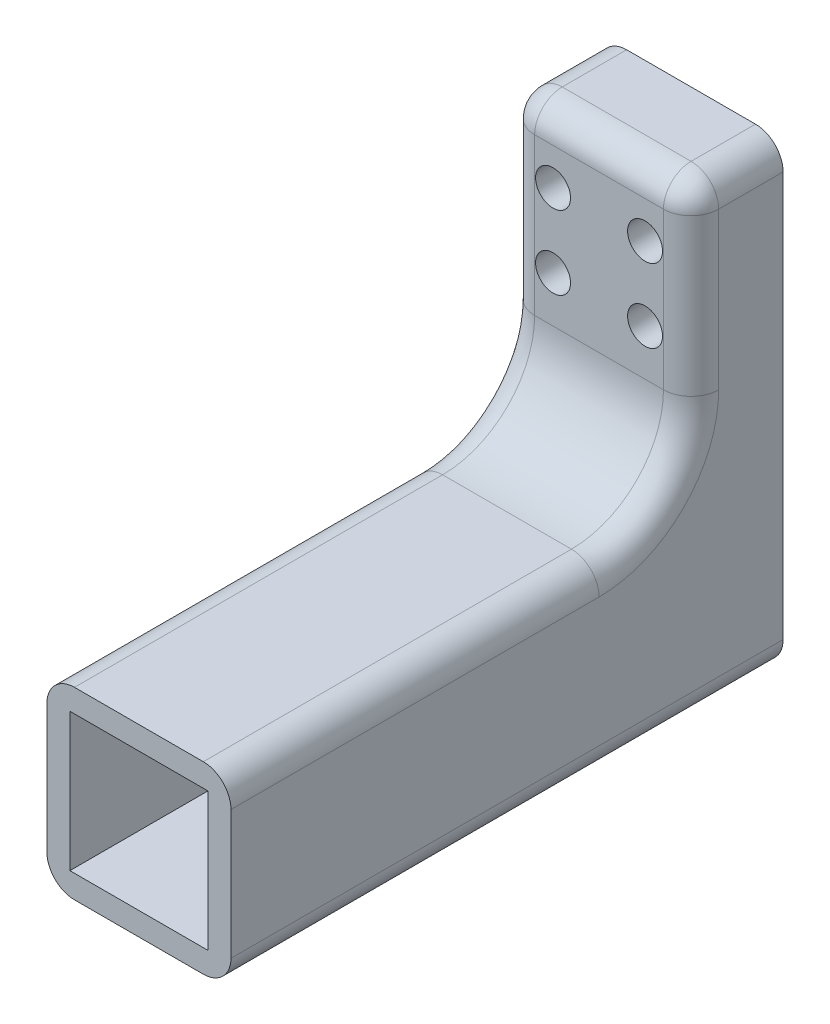
ISO-10303-21;
HEADER;
FILE_DESCRIPTION(('STEP AP214'),'2;1');
FILE_NAME('part.step','',(''),(''),'','','');
FILE_SCHEMA(('AUTOMOTIVE_DESIGN { 1 0 10303 214 1 1 1 1 }'));
ENDSEC;
DATA;
#1=APPLICATION_CONTEXT('core data for automotive mechanical design processes');
#2=APPLICATION_PROTOCOL_DEFINITION('international standard','automotive_design',2000,#1);
#3=PRODUCT_CONTEXT('',#1,'mechanical');
#4=PRODUCT('Part','Part','',(#3));
#5=PRODUCT_RELATED_PRODUCT_CATEGORY('part','',(#4));
#6=PRODUCT_DEFINITION_FORMATION('','',#4);
#7=PRODUCT_DEFINITION_CONTEXT('part definition',#1,'design');
#8=PRODUCT_DEFINITION('design','',#6,#7);
#9=PRODUCT_DEFINITION_SHAPE('','',#8);
#10=(LENGTH_UNIT() NAMED_UNIT(*) SI_UNIT(.MILLI.,.METRE.));
#11=(NAMED_UNIT(*) PLANE_ANGLE_UNIT() SI_UNIT($,.RADIAN.));
#12=(NAMED_UNIT(*) SI_UNIT($,.STERADIAN.) SOLID_ANGLE_UNIT());
#13=UNCERTAINTY_MEASURE_WITH_UNIT(LENGTH_MEASURE(1.E-05),#10,'distance_accuracy_value','');
#14=(GEOMETRIC_REPRESENTATION_CONTEXT(3) GLOBAL_UNCERTAINTY_ASSIGNED_CONTEXT((#13)) GLOBAL_UNIT_ASSIGNED_CONTEXT((#10,
#11,#12)) REPRESENTATION_CONTEXT('',''));
#15=CARTESIAN_POINT('',(0.,0.,0.));
#16=DIRECTION('',(0.,0.,1.));
#17=DIRECTION('',(1.,0.,0.));
#18=AXIS2_PLACEMENT_3D('',#15,#16,#17);
#19=CARTESIAN_POINT('',(-10.,10.,60.));
#20=DIRECTION('',(0.,-1.,0.));
#21=DIRECTION('',(0.,0.,-1.));
#22=AXIS2_PLACEMENT_3D('',#19,#20,#21);
#23=PLANE('',#22);
#24=DIRECTION('',(1.,0.,0.));
#25=VECTOR('',#24,1.);
#26=CARTESIAN_POINT('',(-10.,10.,20.));
#27=LINE('',#26,#25);
#28=CARTESIAN_POINT('',(7.,10.,20.));
#29=VERTEX_POINT('',#28);
#30=CARTESIAN_POINT('',(-7.,10.,20.));
#31=VERTEX_POINT('',#30);
#32=EDGE_CURVE('E236',#29,#31,#27,.F.);
#33=ORIENTED_EDGE('',*,*,#32,.T.);
#34=DIRECTION('',(0.,0.,-1.));
#35=VECTOR('',#34,1.);
#36=CARTESIAN_POINT('',(-7.,10.,60.));
#37=LINE('',#36,#35);
#38=CARTESIAN_POINT('',(-7.,10.,60.));
#39=VERTEX_POINT('',#38);
#40=EDGE_CURVE('E280',#31,#39,#37,.F.);
#41=ORIENTED_EDGE('',*,*,#40,.T.);
#42=DIRECTION('',(-1.,0.,0.));
#43=VECTOR('',#42,1.);
#44=CARTESIAN_POINT('',(-10.,10.,60.));
#45=LINE('',#44,#43);
#46=CARTESIAN_POINT('',(7.,10.,60.));
#47=VERTEX_POINT('',#46);
#48=EDGE_CURVE('E221',#47,#39,#45,.T.);
#49=ORIENTED_EDGE('',*,*,#48,.F.);
#50=DIRECTION('',(0.,0.,-1.));
#51=VECTOR('',#50,1.);
#52=CARTESIAN_POINT('',(7.,10.,60.));
#53=LINE('',#52,#51);
#54=EDGE_CURVE('E278',#47,#29,#53,.T.);
#55=ORIENTED_EDGE('',*,*,#54,.T.);
#56=EDGE_LOOP('',(#33,#41,#49,#55));
#57=FACE_BOUND('',#56,.T.);
#58=ADVANCED_FACE('F41',(#57),#23,.F.);
#59=CARTESIAN_POINT('',(0.,0.,60.));
#60=DIRECTION('',(0.,0.,1.));
#61=DIRECTION('',(1.,0.,0.));
#62=AXIS2_PLACEMENT_3D('',#59,#60,#61);
#63=PLANE('',#62);
#64=DIRECTION('',(1.,0.,0.));
#65=VECTOR('',#64,1.);
#66=CARTESIAN_POINT('',(-10.,-10.,60.));
#67=LINE('',#66,#65);
#68=CARTESIAN_POINT('',(-7.,-10.,60.));
#69=VERTEX_POINT('',#68);
#70=CARTESIAN_POINT('',(7.,-10.,60.));
#71=VERTEX_POINT('',#70);
#72=EDGE_CURVE('E227',#69,#71,#67,.T.);
#73=ORIENTED_EDGE('',*,*,#72,.T.);
#74=CARTESIAN_POINT('',(7.,-7.,60.));
#75=DIRECTION('',(0.,0.,1.));
#76=DIRECTION('',(1.,0.,0.));
#77=AXIS2_PLACEMENT_3D('',#74,#75,#76);
#78=CIRCLE('',#77,3.);
#79=CARTESIAN_POINT('',(10.,-7.,60.));
#80=VERTEX_POINT('',#79);
#81=EDGE_CURVE('E49',#71,#80,#78,.T.);
#82=ORIENTED_EDGE('',*,*,#81,.T.);
#83=DIRECTION('',(0.,1.,0.));
#84=VECTOR('',#83,1.);
#85=CARTESIAN_POINT('',(10.,10.,60.));
#86=LINE('',#85,#84);
#87=CARTESIAN_POINT('',(10.,7.,60.));
#88=VERTEX_POINT('',#87);
#89=EDGE_CURVE('E219',#80,#88,#86,.T.);
#90=ORIENTED_EDGE('',*,*,#89,.T.);
#91=CARTESIAN_POINT('',(7.,7.,60.));
#92=DIRECTION('',(0.,0.,1.));
#93=DIRECTION('',(1.,0.,0.));
#94=AXIS2_PLACEMENT_3D('',#91,#92,#93);
#95=CIRCLE('',#94,3.);
#96=EDGE_CURVE('E282',#88,#47,#95,.T.);
#97=ORIENTED_EDGE('',*,*,#96,.T.);
#98=ORIENTED_EDGE('',*,*,#48,.T.);
#99=CARTESIAN_POINT('',(-7.,7.,60.));
#100=DIRECTION('',(0.,0.,1.));
#101=DIRECTION('',(1.,0.,0.));
#102=AXIS2_PLACEMENT_3D('',#99,#100,#101);
#103=CIRCLE('',#102,3.);
#104=CARTESIAN_POINT('',(-10.,7.,60.));
#105=VERTEX_POINT('',#104);
#106=EDGE_CURVE('E284',#39,#105,#103,.T.);
#107=ORIENTED_EDGE('',*,*,#106,.T.);
#108=DIRECTION('',(0.,-1.,0.));
#109=VECTOR('',#108,1.);
#110=CARTESIAN_POINT('',(-10.,10.,60.));
#111=LINE('',#110,#109);
#112=CARTESIAN_POINT('',(-10.,-7.,60.));
#113=VERTEX_POINT('',#112);
#114=EDGE_CURVE('E225',#105,#113,#111,.T.);
#115=ORIENTED_EDGE('',*,*,#114,.T.);
#116=CARTESIAN_POINT('',(-7.,-7.,60.));
#117=DIRECTION('',(0.,0.,1.));
#118=DIRECTION('',(1.,0.,0.));
#119=AXIS2_PLACEMENT_3D('',#116,#117,#118);
#120=CIRCLE('',#119,3.);
#121=EDGE_CURVE('E327',#113,#69,#120,.T.);
#122=ORIENTED_EDGE('',*,*,#121,.T.);
#123=EDGE_LOOP('',(#73,#82,#90,#97,#98,#107,#115,#122));
#124=FACE_BOUND('',#123,.T.);
#125=DIRECTION('',(-1.,0.,0.));
#126=VECTOR('',#125,1.);
#127=CARTESIAN_POINT('',(-7.5,7.5,60.));
#128=LINE('',#127,#126);
#129=CARTESIAN_POINT('',(7.5,7.5,60.));
#130=VERTEX_POINT('',#129);
#131=CARTESIAN_POINT('',(-7.5,7.5,60.));
#132=VERTEX_POINT('',#131);
#133=EDGE_CURVE('E185',#130,#132,#128,.T.);
#134=ORIENTED_EDGE('',*,*,#133,.F.);
#135=DIRECTION('',(0.,1.,0.));
#136=VECTOR('',#135,1.);
#137=CARTESIAN_POINT('',(7.5,7.5,60.));
#138=LINE('',#137,#136);
#139=CARTESIAN_POINT('',(7.5,-7.5,60.));
#140=VERTEX_POINT('',#139);
#141=EDGE_CURVE('E175',#140,#130,#138,.T.);
#142=ORIENTED_EDGE('',*,*,#141,.F.);
#143=DIRECTION('',(1.,0.,0.));
#144=VECTOR('',#143,1.);
#145=CARTESIAN_POINT('',(-7.5,-7.5,60.));
#146=LINE('',#145,#144);
#147=CARTESIAN_POINT('',(-7.5,-7.5,60.));
#148=VERTEX_POINT('',#147);
#149=EDGE_CURVE('E201',#148,#140,#146,.T.);
#150=ORIENTED_EDGE('',*,*,#149,.F.);
#151=DIRECTION('',(0.,-1.,0.));
#152=VECTOR('',#151,1.);
#153=CARTESIAN_POINT('',(-7.5,7.5,60.));
#154=LINE('',#153,#152);
#155=EDGE_CURVE('E199',#132,#148,#154,.T.);
#156=ORIENTED_EDGE('',*,*,#155,.F.);
#157=EDGE_LOOP('',(#134,#142,#150,#156));
#158=FACE_BOUND('',#157,.T.);
#159=ADVANCED_FACE('F197',(#124,#158),#63,.T.);
#160=CARTESIAN_POINT('',(0.,0.,0.));
#161=DIRECTION('',(0.,0.,1.));
#162=DIRECTION('',(1.,0.,0.));
#163=AXIS2_PLACEMENT_3D('',#160,#161,#162);
#164=PLANE('',#163);
#165=CARTESIAN_POINT('',(-5.,25.,0.));
#166=DIRECTION('',(0.,0.,1.));
#167=DIRECTION('',(1.,0.,0.));
#168=AXIS2_PLACEMENT_3D('',#165,#166,#167);
#169=CIRCLE('',#168,1.9);
#170=CARTESIAN_POINT('',(-3.1,25.,0.));
#171=VERTEX_POINT('',#170);
#172=EDGE_CURVE('E409',#171,#171,#169,.T.);
#173=ORIENTED_EDGE('',*,*,#172,.T.);
#174=EDGE_LOOP('',(#173));
#175=FACE_BOUND('',#174,.T.);
#176=CARTESIAN_POINT('',(-5.,33.,0.));
#177=DIRECTION('',(0.,0.,1.));
#178=DIRECTION('',(1.,0.,0.));
#179=AXIS2_PLACEMENT_3D('',#176,#177,#178);
#180=CIRCLE('',#179,1.9);
#181=CARTESIAN_POINT('',(-3.1,33.,0.));
#182=VERTEX_POINT('',#181);
#183=EDGE_CURVE('E415',#182,#182,#180,.T.);
#184=ORIENTED_EDGE('',*,*,#183,.T.);
#185=EDGE_LOOP('',(#184));
#186=FACE_BOUND('',#185,.T.);
#187=CARTESIAN_POINT('',(5.,33.,0.));
#188=DIRECTION('',(0.,0.,1.));
#189=DIRECTION('',(1.,0.,0.));
#190=AXIS2_PLACEMENT_3D('',#187,#188,#189);
#191=CIRCLE('',#190,1.9);
#192=CARTESIAN_POINT('',(6.9,33.,0.));
#193=VERTEX_POINT('',#192);
#194=EDGE_CURVE('E403',#193,#193,#191,.T.);
#195=ORIENTED_EDGE('',*,*,#194,.T.);
#196=EDGE_LOOP('',(#195));
#197=FACE_BOUND('',#196,.T.);
#198=CARTESIAN_POINT('',(5.,25.,0.));
#199=DIRECTION('',(0.,0.,1.));
#200=DIRECTION('',(1.,0.,0.));
#201=AXIS2_PLACEMENT_3D('',#198,#199,#200);
#202=CIRCLE('',#201,1.9);
#203=CARTESIAN_POINT('',(6.9,25.,0.));
#204=VERTEX_POINT('',#203);
#205=EDGE_CURVE('E400',#204,#204,#202,.T.);
#206=ORIENTED_EDGE('',*,*,#205,.T.);
#207=EDGE_LOOP('',(#206));
#208=FACE_BOUND('',#207,.T.);
#209=DIRECTION('',(0.,1.,0.));
#210=VECTOR('',#209,1.);
#211=CARTESIAN_POINT('',(10.,10.,0.));
#212=LINE('',#211,#210);
#213=CARTESIAN_POINT('',(10.,-7.,0.));
#214=VERTEX_POINT('',#213);
#215=CARTESIAN_POINT('',(9.99999999999999,37.,0.));
#216=VERTEX_POINT('',#215);
#217=EDGE_CURVE('E193',#214,#216,#212,.T.);
#218=ORIENTED_EDGE('',*,*,#217,.F.);
#219=CARTESIAN_POINT('',(7.,-7.,0.));
#220=DIRECTION('',(0.,0.,1.));
#221=DIRECTION('',(1.,0.,0.));
#222=AXIS2_PLACEMENT_3D('',#219,#220,#221);
#223=CIRCLE('',#222,3.);
#224=CARTESIAN_POINT('',(7.,-10.,0.));
#225=VERTEX_POINT('',#224);
#226=EDGE_CURVE('E321',#214,#225,#223,.F.);
#227=ORIENTED_EDGE('',*,*,#226,.T.);
#228=DIRECTION('',(1.,0.,0.));
#229=VECTOR('',#228,1.);
#230=CARTESIAN_POINT('',(-10.,-10.,0.));
#231=LINE('',#230,#229);
#232=CARTESIAN_POINT('',(-7.,-10.,0.));
#233=VERTEX_POINT('',#232);
#234=EDGE_CURVE('E222',#233,#225,#231,.T.);
#235=ORIENTED_EDGE('',*,*,#234,.F.);
#236=CARTESIAN_POINT('',(-7.,-7.,0.));
#237=DIRECTION('',(0.,0.,1.));
#238=DIRECTION('',(1.,0.,0.));
#239=AXIS2_PLACEMENT_3D('',#236,#237,#238);
#240=CIRCLE('',#239,3.);
#241=CARTESIAN_POINT('',(-10.,-7.,0.));
#242=VERTEX_POINT('',#241);
#243=EDGE_CURVE('E319',#233,#242,#240,.F.);
#244=ORIENTED_EDGE('',*,*,#243,.T.);
#245=DIRECTION('',(0.,-1.,0.));
#246=VECTOR('',#245,1.);
#247=CARTESIAN_POINT('',(-10.,10.,0.));
#248=LINE('',#247,#246);
#249=CARTESIAN_POINT('',(-10.,37.,0.));
#250=VERTEX_POINT('',#249);
#251=EDGE_CURVE('E231',#250,#242,#248,.T.);
#252=ORIENTED_EDGE('',*,*,#251,.F.);
#253=CARTESIAN_POINT('',(-7.00000000000001,37.,0.));
#254=DIRECTION('',(0.,0.,1.));
#255=DIRECTION('',(1.,0.,0.));
#256=AXIS2_PLACEMENT_3D('',#253,#254,#255);
#257=CIRCLE('',#256,3.);
#258=CARTESIAN_POINT('',(-7.,40.,0.));
#259=VERTEX_POINT('',#258);
#260=EDGE_CURVE('E273',#250,#259,#257,.F.);
#261=ORIENTED_EDGE('',*,*,#260,.T.);
#262=DIRECTION('',(-1.,0.,0.));
#263=VECTOR('',#262,1.);
#264=CARTESIAN_POINT('',(10.,40.,0.));
#265=LINE('',#264,#263);
#266=CARTESIAN_POINT('',(6.99999999999999,40.,0.));
#267=VERTEX_POINT('',#266);
#268=EDGE_CURVE('E208',#267,#259,#265,.T.);
#269=ORIENTED_EDGE('',*,*,#268,.F.);
#270=CARTESIAN_POINT('',(6.99999999999999,37.,0.));
#271=DIRECTION('',(0.,0.,1.));
#272=DIRECTION('',(1.,0.,0.));
#273=AXIS2_PLACEMENT_3D('',#270,#271,#272);
#274=CIRCLE('',#273,3.);
#275=EDGE_CURVE('E275',#267,#216,#274,.F.);
#276=ORIENTED_EDGE('',*,*,#275,.T.);
#277=EDGE_LOOP('',(#218,#227,#235,#244,#252,#261,#269,#276));
#278=FACE_BOUND('',#277,.T.);
#279=DIRECTION('',(0.,1.,0.));
#280=VECTOR('',#279,1.);
#281=CARTESIAN_POINT('',(7.5,7.5,0.));
#282=LINE('',#281,#280);
#283=CARTESIAN_POINT('',(7.5,-7.5,0.));
#284=VERTEX_POINT('',#283);
#285=CARTESIAN_POINT('',(7.5,7.5,0.));
#286=VERTEX_POINT('',#285);
#287=EDGE_CURVE('E206',#284,#286,#282,.T.);
#288=ORIENTED_EDGE('',*,*,#287,.T.);
#289=DIRECTION('',(-1.,0.,0.));
#290=VECTOR('',#289,1.);
#291=CARTESIAN_POINT('',(-7.5,7.5,0.));
#292=LINE('',#291,#290);
#293=CARTESIAN_POINT('',(-7.5,7.5,0.));
#294=VERTEX_POINT('',#293);
#295=EDGE_CURVE('E192',#286,#294,#292,.T.);
#296=ORIENTED_EDGE('',*,*,#295,.T.);
#297=DIRECTION('',(0.,-1.,0.));
#298=VECTOR('',#297,1.);
#299=CARTESIAN_POINT('',(-7.5,7.5,0.));
#300=LINE('',#299,#298);
#301=CARTESIAN_POINT('',(-7.5,-7.5,0.));
#302=VERTEX_POINT('',#301);
#303=EDGE_CURVE('E210',#294,#302,#300,.T.);
#304=ORIENTED_EDGE('',*,*,#303,.T.);
#305=DIRECTION('',(1.,0.,0.));
#306=VECTOR('',#305,1.);
#307=CARTESIAN_POINT('',(-7.5,-7.5,0.));
#308=LINE('',#307,#306);
#309=EDGE_CURVE('E186',#302,#284,#308,.T.);
#310=ORIENTED_EDGE('',*,*,#309,.T.);
#311=EDGE_LOOP('',(#288,#296,#304,#310));
#312=FACE_BOUND('',#311,.T.);
#313=ADVANCED_FACE('F341',(#175,#186,#197,#208,#278,#312),#164,.F.);
#314=CARTESIAN_POINT('',(10.,10.,60.));
#315=DIRECTION('',(-1.,0.,0.));
#316=DIRECTION('',(0.,-1.,0.));
#317=AXIS2_PLACEMENT_3D('',#314,#315,#316);
#318=PLANE('',#317);
#319=ORIENTED_EDGE('',*,*,#89,.F.);
#320=DIRECTION('',(0.,0.,-1.));
#321=VECTOR('',#320,1.);
#322=CARTESIAN_POINT('',(10.,-7.,60.));
#323=LINE('',#322,#321);
#324=EDGE_CURVE('E286',#80,#214,#323,.T.);
#325=ORIENTED_EDGE('',*,*,#324,.T.);
#326=ORIENTED_EDGE('',*,*,#217,.T.);
#327=DIRECTION('',(0.,0.,-1.));
#328=VECTOR('',#327,1.);
#329=CARTESIAN_POINT('',(9.99999999999999,37.,60.));
#330=LINE('',#329,#328);
#331=CARTESIAN_POINT('',(9.99999999999999,37.,7.));
#332=VERTEX_POINT('',#331);
#333=EDGE_CURVE('E265',#216,#332,#330,.F.);
#334=ORIENTED_EDGE('',*,*,#333,.T.);
#335=DIRECTION('',(0.,1.,0.));
#336=VECTOR('',#335,1.);
#337=CARTESIAN_POINT('',(9.99999999999999,20.,7.));
#338=LINE('',#337,#336);
#339=CARTESIAN_POINT('',(9.99999999999999,20.,7.));
#340=VERTEX_POINT('',#339);
#341=EDGE_CURVE('E263',#332,#340,#338,.F.);
#342=ORIENTED_EDGE('',*,*,#341,.T.);
#343=CARTESIAN_POINT('',(9.99999999999999,20.,20.));
#344=DIRECTION('',(-1.,0.,0.));
#345=DIRECTION('',(0.,-1.,0.));
#346=AXIS2_PLACEMENT_3D('',#343,#344,#345);
#347=CIRCLE('',#346,13.);
#348=CARTESIAN_POINT('',(10.,7.,20.));
#349=VERTEX_POINT('',#348);
#350=EDGE_CURVE('E261',#340,#349,#347,.T.);
#351=ORIENTED_EDGE('',*,*,#350,.T.);
#352=DIRECTION('',(0.,0.,-1.));
#353=VECTOR('',#352,1.);
#354=CARTESIAN_POINT('',(10.,7.,60.));
#355=LINE('',#354,#353);
#356=EDGE_CURVE('E258',#349,#88,#355,.F.);
#357=ORIENTED_EDGE('',*,*,#356,.T.);
#358=EDGE_LOOP('',(#319,#325,#326,#334,#342,#351,#357));
#359=FACE_BOUND('',#358,.T.);
#360=ADVANCED_FACE('F334',(#359),#318,.F.);
#361=CARTESIAN_POINT('',(-10.,10.,60.));
#362=DIRECTION('',(1.,0.,0.));
#363=DIRECTION('',(0.,1.,0.));
#364=AXIS2_PLACEMENT_3D('',#361,#362,#363);
#365=PLANE('',#364);
#366=ORIENTED_EDGE('',*,*,#251,.T.);
#367=DIRECTION('',(0.,0.,-1.));
#368=VECTOR('',#367,1.);
#369=CARTESIAN_POINT('',(-10.,-7.,60.));
#370=LINE('',#369,#368);
#371=EDGE_CURVE('E11',#242,#113,#370,.F.);
#372=ORIENTED_EDGE('',*,*,#371,.T.);
#373=ORIENTED_EDGE('',*,*,#114,.F.);
#374=DIRECTION('',(0.,0.,-1.));
#375=VECTOR('',#374,1.);
#376=CARTESIAN_POINT('',(-10.,7.,60.));
#377=LINE('',#376,#375);
#378=CARTESIAN_POINT('',(-10.,7.,20.));
#379=VERTEX_POINT('',#378);
#380=EDGE_CURVE('E246',#105,#379,#377,.T.);
#381=ORIENTED_EDGE('',*,*,#380,.T.);
#382=CARTESIAN_POINT('',(-10.,20.,20.));
#383=DIRECTION('',(1.,0.,0.));
#384=DIRECTION('',(0.,1.,0.));
#385=AXIS2_PLACEMENT_3D('',#382,#383,#384);
#386=CIRCLE('',#385,13.);
#387=CARTESIAN_POINT('',(-10.,20.,7.));
#388=VERTEX_POINT('',#387);
#389=EDGE_CURVE('E248',#379,#388,#386,.T.);
#390=ORIENTED_EDGE('',*,*,#389,.T.);
#391=DIRECTION('',(0.,-1.,0.));
#392=VECTOR('',#391,1.);
#393=CARTESIAN_POINT('',(-10.,40.,7.));
#394=LINE('',#393,#392);
#395=CARTESIAN_POINT('',(-10.,37.,7.));
#396=VERTEX_POINT('',#395);
#397=EDGE_CURVE('E250',#388,#396,#394,.F.);
#398=ORIENTED_EDGE('',*,*,#397,.T.);
#399=DIRECTION('',(0.,0.,-1.));
#400=VECTOR('',#399,1.);
#401=CARTESIAN_POINT('',(-10.,37.,60.));
#402=LINE('',#401,#400);
#403=EDGE_CURVE('E252',#396,#250,#402,.T.);
#404=ORIENTED_EDGE('',*,*,#403,.T.);
#405=EDGE_LOOP('',(#366,#372,#373,#381,#390,#398,#404));
#406=FACE_BOUND('',#405,.T.);
#407=ADVANCED_FACE('F349',(#406),#365,.F.);
#408=CARTESIAN_POINT('',(-10.,-10.,60.));
#409=DIRECTION('',(0.,1.,0.));
#410=DIRECTION('',(0.,0.,1.));
#411=AXIS2_PLACEMENT_3D('',#408,#409,#410);
#412=PLANE('',#411);
#413=ORIENTED_EDGE('',*,*,#234,.T.);
#414=DIRECTION('',(0.,0.,-1.));
#415=VECTOR('',#414,1.);
#416=CARTESIAN_POINT('',(7.,-10.,60.));
#417=LINE('',#416,#415);
#418=EDGE_CURVE('E62',#225,#71,#417,.F.);
#419=ORIENTED_EDGE('',*,*,#418,.T.);
#420=ORIENTED_EDGE('',*,*,#72,.F.);
#421=DIRECTION('',(0.,0.,-1.));
#422=VECTOR('',#421,1.);
#423=CARTESIAN_POINT('',(-7.,-10.,60.));
#424=LINE('',#423,#422);
#425=EDGE_CURVE('E323',#69,#233,#424,.T.);
#426=ORIENTED_EDGE('',*,*,#425,.T.);
#427=EDGE_LOOP('',(#413,#419,#420,#426));
#428=FACE_BOUND('',#427,.T.);
#429=ADVANCED_FACE('F343',(#428),#412,.F.);
#430=CARTESIAN_POINT('',(7.5,7.5,60.));
#431=DIRECTION('',(-1.,0.,0.));
#432=DIRECTION('',(0.,-1.,0.));
#433=AXIS2_PLACEMENT_3D('',#430,#431,#432);
#434=PLANE('',#433);
#435=ORIENTED_EDGE('',*,*,#287,.F.);
#436=DIRECTION('',(0.,0.,-1.));
#437=VECTOR('',#436,1.);
#438=CARTESIAN_POINT('',(7.5,-7.5,60.));
#439=LINE('',#438,#437);
#440=EDGE_CURVE('E181',#140,#284,#439,.T.);
#441=ORIENTED_EDGE('',*,*,#440,.F.);
#442=ORIENTED_EDGE('',*,*,#141,.T.);
#443=DIRECTION('',(0.,0.,-1.));
#444=VECTOR('',#443,1.);
#445=CARTESIAN_POINT('',(7.5,7.5,60.));
#446=LINE('',#445,#444);
#447=EDGE_CURVE('E178',#130,#286,#446,.T.);
#448=ORIENTED_EDGE('',*,*,#447,.T.);
#449=EDGE_LOOP('',(#435,#441,#442,#448));
#450=FACE_BOUND('',#449,.T.);
#451=ADVANCED_FACE('F177',(#450),#434,.T.);
#452=CARTESIAN_POINT('',(-7.5,7.5,60.));
#453=DIRECTION('',(0.,-1.,0.));
#454=DIRECTION('',(0.,0.,-1.));
#455=AXIS2_PLACEMENT_3D('',#452,#453,#454);
#456=PLANE('',#455);
#457=ORIENTED_EDGE('',*,*,#295,.F.);
#458=ORIENTED_EDGE('',*,*,#447,.F.);
#459=ORIENTED_EDGE('',*,*,#133,.T.);
#460=DIRECTION('',(0.,0.,-1.));
#461=VECTOR('',#460,1.);
#462=CARTESIAN_POINT('',(-7.5,7.5,60.));
#463=LINE('',#462,#461);
#464=EDGE_CURVE('E194',#132,#294,#463,.T.);
#465=ORIENTED_EDGE('',*,*,#464,.T.);
#466=EDGE_LOOP('',(#457,#458,#459,#465));
#467=FACE_BOUND('',#466,.T.);
#468=ADVANCED_FACE('F189',(#467),#456,.T.);
#469=CARTESIAN_POINT('',(-7.5,7.5,60.));
#470=DIRECTION('',(1.,0.,0.));
#471=DIRECTION('',(0.,1.,0.));
#472=AXIS2_PLACEMENT_3D('',#469,#470,#471);
#473=PLANE('',#472);
#474=ORIENTED_EDGE('',*,*,#303,.F.);
#475=ORIENTED_EDGE('',*,*,#464,.F.);
#476=ORIENTED_EDGE('',*,*,#155,.T.);
#477=DIRECTION('',(0.,0.,-1.));
#478=VECTOR('',#477,1.);
#479=CARTESIAN_POINT('',(-7.5,-7.5,60.));
#480=LINE('',#479,#478);
#481=EDGE_CURVE('E216',#148,#302,#480,.T.);
#482=ORIENTED_EDGE('',*,*,#481,.T.);
#483=EDGE_LOOP('',(#474,#475,#476,#482));
#484=FACE_BOUND('',#483,.T.);
#485=ADVANCED_FACE('F642',(#484),#473,.T.);
#486=CARTESIAN_POINT('',(-7.5,-7.5,60.));
#487=DIRECTION('',(0.,1.,0.));
#488=DIRECTION('',(0.,0.,1.));
#489=AXIS2_PLACEMENT_3D('',#486,#487,#488);
#490=PLANE('',#489);
#491=ORIENTED_EDGE('',*,*,#309,.F.);
#492=ORIENTED_EDGE('',*,*,#481,.F.);
#493=ORIENTED_EDGE('',*,*,#149,.T.);
#494=ORIENTED_EDGE('',*,*,#440,.T.);
#495=EDGE_LOOP('',(#491,#492,#493,#494));
#496=FACE_BOUND('',#495,.T.);
#497=ADVANCED_FACE('F624',(#496),#490,.T.);
#498=CARTESIAN_POINT('',(10.,40.,10.));
#499=DIRECTION('',(0.,-1.,0.));
#500=DIRECTION('',(0.,0.,-1.));
#501=AXIS2_PLACEMENT_3D('',#498,#499,#500);
#502=PLANE('',#501);
#503=DIRECTION('',(-1.,0.,0.));
#504=VECTOR('',#503,1.);
#505=CARTESIAN_POINT('',(10.,40.,7.));
#506=LINE('',#505,#504);
#507=CARTESIAN_POINT('',(-7.00000000000001,40.,7.));
#508=VERTEX_POINT('',#507);
#509=CARTESIAN_POINT('',(6.99999999999999,40.,7.));
#510=VERTEX_POINT('',#509);
#511=EDGE_CURVE('E269',#508,#510,#506,.F.);
#512=ORIENTED_EDGE('',*,*,#511,.T.);
#513=DIRECTION('',(0.,0.,-1.));
#514=VECTOR('',#513,1.);
#515=CARTESIAN_POINT('',(6.99999999999999,40.,10.));
#516=LINE('',#515,#514);
#517=EDGE_CURVE('E271',#510,#267,#516,.T.);
#518=ORIENTED_EDGE('',*,*,#517,.T.);
#519=ORIENTED_EDGE('',*,*,#268,.T.);
#520=DIRECTION('',(0.,0.,-1.));
#521=VECTOR('',#520,1.);
#522=CARTESIAN_POINT('',(-7.,40.,10.));
#523=LINE('',#522,#521);
#524=EDGE_CURVE('E267',#259,#508,#523,.F.);
#525=ORIENTED_EDGE('',*,*,#524,.T.);
#526=EDGE_LOOP('',(#512,#518,#519,#525));
#527=FACE_BOUND('',#526,.T.);
#528=ADVANCED_FACE('F392',(#527),#502,.F.);
#529=CARTESIAN_POINT('',(0.,0.,10.));
#530=DIRECTION('',(0.,0.,1.));
#531=DIRECTION('',(1.,0.,0.));
#532=AXIS2_PLACEMENT_3D('',#529,#530,#531);
#533=PLANE('',#532);
#534=CARTESIAN_POINT('',(-5.,25.,10.));
#535=DIRECTION('',(0.,0.,1.));
#536=DIRECTION('',(1.,0.,0.));
#537=AXIS2_PLACEMENT_3D('',#534,#535,#536);
#538=CIRCLE('',#537,1.9);
#539=CARTESIAN_POINT('',(-3.1,25.,10.));
#540=VERTEX_POINT('',#539);
#541=EDGE_CURVE('E406',#540,#540,#538,.T.);
#542=ORIENTED_EDGE('',*,*,#541,.F.);
#543=EDGE_LOOP('',(#542));
#544=FACE_BOUND('',#543,.T.);
#545=CARTESIAN_POINT('',(-5.,33.,10.));
#546=DIRECTION('',(0.,0.,1.));
#547=DIRECTION('',(1.,0.,0.));
#548=AXIS2_PLACEMENT_3D('',#545,#546,#547);
#549=CIRCLE('',#548,1.9);
#550=CARTESIAN_POINT('',(-3.1,33.,10.));
#551=VERTEX_POINT('',#550);
#552=EDGE_CURVE('E412',#551,#551,#549,.T.);
#553=ORIENTED_EDGE('',*,*,#552,.F.);
#554=EDGE_LOOP('',(#553));
#555=FACE_BOUND('',#554,.T.);
#556=CARTESIAN_POINT('',(5.,33.,10.));
#557=DIRECTION('',(0.,0.,1.));
#558=DIRECTION('',(1.,0.,0.));
#559=AXIS2_PLACEMENT_3D('',#556,#557,#558);
#560=CIRCLE('',#559,1.9);
#561=CARTESIAN_POINT('',(6.9,33.,10.));
#562=VERTEX_POINT('',#561);
#563=EDGE_CURVE('E418',#562,#562,#560,.T.);
#564=ORIENTED_EDGE('',*,*,#563,.F.);
#565=EDGE_LOOP('',(#564));
#566=FACE_BOUND('',#565,.T.);
#567=CARTESIAN_POINT('',(5.,25.,10.));
#568=DIRECTION('',(0.,0.,1.));
#569=DIRECTION('',(1.,0.,0.));
#570=AXIS2_PLACEMENT_3D('',#567,#568,#569);
#571=CIRCLE('',#570,1.9);
#572=CARTESIAN_POINT('',(6.9,25.,10.));
#573=VERTEX_POINT('',#572);
#574=EDGE_CURVE('E290',#573,#573,#571,.T.);
#575=ORIENTED_EDGE('',*,*,#574,.F.);
#576=EDGE_LOOP('',(#575));
#577=FACE_BOUND('',#576,.T.);
#578=DIRECTION('',(-1.,0.,0.));
#579=VECTOR('',#578,1.);
#580=CARTESIAN_POINT('',(-10.,37.,10.));
#581=LINE('',#580,#579);
#582=CARTESIAN_POINT('',(6.99999999999999,37.,10.));
#583=VERTEX_POINT('',#582);
#584=CARTESIAN_POINT('',(-7.00000000000001,37.,10.));
#585=VERTEX_POINT('',#584);
#586=EDGE_CURVE('E239',#583,#585,#581,.T.);
#587=ORIENTED_EDGE('',*,*,#586,.T.);
#588=DIRECTION('',(0.,-1.,0.));
#589=VECTOR('',#588,1.);
#590=CARTESIAN_POINT('',(-7.,20.,10.));
#591=LINE('',#590,#589);
#592=CARTESIAN_POINT('',(-7.,20.,10.));
#593=VERTEX_POINT('',#592);
#594=EDGE_CURVE('E243',#585,#593,#591,.T.);
#595=ORIENTED_EDGE('',*,*,#594,.T.);
#596=DIRECTION('',(1.,0.,0.));
#597=VECTOR('',#596,1.);
#598=CARTESIAN_POINT('',(0.,20.,10.));
#599=LINE('',#598,#597);
#600=CARTESIAN_POINT('',(7.,20.,10.));
#601=VERTEX_POINT('',#600);
#602=EDGE_CURVE('E229',#593,#601,#599,.T.);
#603=ORIENTED_EDGE('',*,*,#602,.T.);
#604=DIRECTION('',(0.,1.,0.));
#605=VECTOR('',#604,1.);
#606=CARTESIAN_POINT('',(6.99999999999999,40.,10.));
#607=LINE('',#606,#605);
#608=EDGE_CURVE('E241',#601,#583,#607,.T.);
#609=ORIENTED_EDGE('',*,*,#608,.T.);
#610=EDGE_LOOP('',(#587,#595,#603,#609));
#611=FACE_BOUND('',#610,.T.);
#612=ADVANCED_FACE('F367',(#544,#555,#566,#577,#611),#533,.T.);
#613=CARTESIAN_POINT('',(0.,20.,20.));
#614=DIRECTION('',(1.,0.,0.));
#615=DIRECTION('',(0.,0.,-1.));
#616=AXIS2_PLACEMENT_3D('',#613,#614,#615);
#617=CYLINDRICAL_SURFACE('',#616,10.);
#618=ORIENTED_EDGE('',*,*,#602,.F.);
#619=CARTESIAN_POINT('',(-7.,20.,20.));
#620=DIRECTION('',(1.,0.,0.));
#621=DIRECTION('',(0.,1.,0.));
#622=AXIS2_PLACEMENT_3D('',#619,#620,#621);
#623=CIRCLE('',#622,10.);
#624=EDGE_CURVE('E256',#593,#31,#623,.F.);
#625=ORIENTED_EDGE('',*,*,#624,.T.);
#626=ORIENTED_EDGE('',*,*,#32,.F.);
#627=CARTESIAN_POINT('',(7.,20.,20.));
#628=DIRECTION('',(-1.,0.,0.));
#629=DIRECTION('',(0.,-1.,0.));
#630=AXIS2_PLACEMENT_3D('',#627,#628,#629);
#631=CIRCLE('',#630,10.);
#632=EDGE_CURVE('E254',#29,#601,#631,.F.);
#633=ORIENTED_EDGE('',*,*,#632,.T.);
#634=EDGE_LOOP('',(#618,#625,#626,#633));
#635=FACE_BOUND('',#634,.T.);
#636=ADVANCED_FACE('F371',(#635),#617,.F.);
#637=CARTESIAN_POINT('',(7.,7.,60.));
#638=DIRECTION('',(0.,0.,-1.));
#639=DIRECTION('',(-1.,0.,0.));
#640=AXIS2_PLACEMENT_3D('',#637,#638,#639);
#641=CYLINDRICAL_SURFACE('',#640,3.);
#642=ORIENTED_EDGE('',*,*,#96,.F.);
#643=ORIENTED_EDGE('',*,*,#356,.F.);
#644=CARTESIAN_POINT('',(7.,7.,20.));
#645=DIRECTION('',(0.,0.,-1.));
#646=DIRECTION('',(-1.,0.,0.));
#647=AXIS2_PLACEMENT_3D('',#644,#645,#646);
#648=CIRCLE('',#647,3.);
#649=EDGE_CURVE('E314',#29,#349,#648,.T.);
#650=ORIENTED_EDGE('',*,*,#649,.F.);
#651=ORIENTED_EDGE('',*,*,#54,.F.);
#652=EDGE_LOOP('',(#642,#643,#650,#651));
#653=FACE_BOUND('',#652,.T.);
#654=ADVANCED_FACE('F455',(#653),#641,.T.);
#655=CARTESIAN_POINT('',(7.,20.,20.));
#656=DIRECTION('',(-1.,0.,0.));
#657=DIRECTION('',(0.,-1.,0.));
#658=AXIS2_PLACEMENT_3D('',#655,#656,#657);
#659=TOROIDAL_SURFACE('',#658,13.,3.);
#660=ORIENTED_EDGE('',*,*,#649,.T.);
#661=ORIENTED_EDGE('',*,*,#350,.F.);
#662=CARTESIAN_POINT('',(7.,20.,7.));
#663=DIRECTION('',(0.,1.,0.));
#664=DIRECTION('',(0.,0.,1.));
#665=AXIS2_PLACEMENT_3D('',#662,#663,#664);
#666=CIRCLE('',#665,3.);
#667=EDGE_CURVE('E311',#601,#340,#666,.T.);
#668=ORIENTED_EDGE('',*,*,#667,.F.);
#669=ORIENTED_EDGE('',*,*,#632,.F.);
#670=EDGE_LOOP('',(#660,#661,#668,#669));
#671=FACE_BOUND('',#670,.T.);
#672=ADVANCED_FACE('F376',(#671),#659,.T.);
#673=CARTESIAN_POINT('',(6.99999999999999,37.,10.));
#674=DIRECTION('',(0.,0.,-1.));
#675=DIRECTION('',(-1.,0.,0.));
#676=AXIS2_PLACEMENT_3D('',#673,#674,#675);
#677=CYLINDRICAL_SURFACE('',#676,3.);
#678=ORIENTED_EDGE('',*,*,#275,.F.);
#679=ORIENTED_EDGE('',*,*,#517,.F.);
#680=CARTESIAN_POINT('',(6.99999999999999,37.,7.));
#681=DIRECTION('',(0.,0.,1.));
#682=DIRECTION('',(1.,0.,0.));
#683=AXIS2_PLACEMENT_3D('',#680,#681,#682);
#684=CIRCLE('',#683,3.);
#685=EDGE_CURVE('E308',#332,#510,#684,.T.);
#686=ORIENTED_EDGE('',*,*,#685,.F.);
#687=ORIENTED_EDGE('',*,*,#333,.F.);
#688=EDGE_LOOP('',(#678,#679,#686,#687));
#689=FACE_BOUND('',#688,.T.);
#690=ADVANCED_FACE('F397',(#689),#677,.T.);
#691=CARTESIAN_POINT('',(7.,0.,7.));
#692=DIRECTION('',(0.,-1.,0.));
#693=DIRECTION('',(1.,0.,0.));
#694=AXIS2_PLACEMENT_3D('',#691,#692,#693);
#695=CYLINDRICAL_SURFACE('',#694,3.);
#696=ORIENTED_EDGE('',*,*,#667,.T.);
#697=ORIENTED_EDGE('',*,*,#341,.F.);
#698=CARTESIAN_POINT('',(6.99999999999999,37.,7.));
#699=DIRECTION('',(0.,1.,0.));
#700=DIRECTION('',(0.,0.,1.));
#701=AXIS2_PLACEMENT_3D('',#698,#699,#700);
#702=CIRCLE('',#701,3.);
#703=EDGE_CURVE('E305',#583,#332,#702,.T.);
#704=ORIENTED_EDGE('',*,*,#703,.F.);
#705=ORIENTED_EDGE('',*,*,#608,.F.);
#706=EDGE_LOOP('',(#696,#697,#704,#705));
#707=FACE_BOUND('',#706,.T.);
#708=ADVANCED_FACE('F382',(#707),#695,.T.);
#709=CARTESIAN_POINT('',(6.99999999999999,37.,7.));
#710=DIRECTION('',(1.,0.,0.));
#711=DIRECTION('',(0.,0.,-1.));
#712=AXIS2_PLACEMENT_3D('',#709,#710,#711);
#713=SPHERICAL_SURFACE('',#712,3.);
#714=ORIENTED_EDGE('',*,*,#703,.T.);
#715=ORIENTED_EDGE('',*,*,#685,.T.);
#716=CARTESIAN_POINT('',(6.99999999999999,37.,7.));
#717=DIRECTION('',(1.,0.,0.));
#718=DIRECTION('',(0.,0.,-1.));
#719=AXIS2_PLACEMENT_3D('',#716,#717,#718);
#720=CIRCLE('',#719,3.);
#721=EDGE_CURVE('E302',#583,#510,#720,.F.);
#722=ORIENTED_EDGE('',*,*,#721,.F.);
#723=EDGE_LOOP('',(#714,#715,#722));
#724=FACE_BOUND('',#723,.T.);
#725=ADVANCED_FACE('F386',(#724),#713,.T.);
#726=CARTESIAN_POINT('',(-7.00000000000001,37.,60.));
#727=DIRECTION('',(0.,0.,-1.));
#728=DIRECTION('',(-1.,0.,0.));
#729=AXIS2_PLACEMENT_3D('',#726,#727,#728);
#730=CYLINDRICAL_SURFACE('',#729,3.);
#731=ORIENTED_EDGE('',*,*,#260,.F.);
#732=ORIENTED_EDGE('',*,*,#403,.F.);
#733=CARTESIAN_POINT('',(-7.00000000000001,37.,7.));
#734=DIRECTION('',(0.,0.,1.));
#735=DIRECTION('',(1.,0.,0.));
#736=AXIS2_PLACEMENT_3D('',#733,#734,#735);
#737=CIRCLE('',#736,3.);
#738=EDGE_CURVE('E299',#508,#396,#737,.T.);
#739=ORIENTED_EDGE('',*,*,#738,.F.);
#740=ORIENTED_EDGE('',*,*,#524,.F.);
#741=EDGE_LOOP('',(#731,#732,#739,#740));
#742=FACE_BOUND('',#741,.T.);
#743=ADVANCED_FACE('F354',(#742),#730,.T.);
#744=CARTESIAN_POINT('',(0.,37.,7.));
#745=DIRECTION('',(1.,0.,0.));
#746=DIRECTION('',(0.,0.,-1.));
#747=AXIS2_PLACEMENT_3D('',#744,#745,#746);
#748=CYLINDRICAL_SURFACE('',#747,3.);
#749=ORIENTED_EDGE('',*,*,#721,.T.);
#750=ORIENTED_EDGE('',*,*,#511,.F.);
#751=CARTESIAN_POINT('',(-7.00000000000001,37.,7.));
#752=DIRECTION('',(-1.,0.,0.));
#753=DIRECTION('',(0.,0.,1.));
#754=AXIS2_PLACEMENT_3D('',#751,#752,#753);
#755=CIRCLE('',#754,3.);
#756=EDGE_CURVE('E296',#585,#508,#755,.T.);
#757=ORIENTED_EDGE('',*,*,#756,.F.);
#758=ORIENTED_EDGE('',*,*,#586,.F.);
#759=EDGE_LOOP('',(#749,#750,#757,#758));
#760=FACE_BOUND('',#759,.T.);
#761=ADVANCED_FACE('F389',(#760),#748,.T.);
#762=CARTESIAN_POINT('',(-7.,7.,60.));
#763=DIRECTION('',(0.,0.,-1.));
#764=DIRECTION('',(-1.,0.,0.));
#765=AXIS2_PLACEMENT_3D('',#762,#763,#764);
#766=CYLINDRICAL_SURFACE('',#765,3.);
#767=ORIENTED_EDGE('',*,*,#106,.F.);
#768=ORIENTED_EDGE('',*,*,#40,.F.);
#769=CARTESIAN_POINT('',(-7.,7.,20.));
#770=DIRECTION('',(0.,0.,-1.));
#771=DIRECTION('',(-1.,0.,0.));
#772=AXIS2_PLACEMENT_3D('',#769,#770,#771);
#773=CIRCLE('',#772,3.);
#774=EDGE_CURVE('E293',#379,#31,#773,.T.);
#775=ORIENTED_EDGE('',*,*,#774,.F.);
#776=ORIENTED_EDGE('',*,*,#380,.F.);
#777=EDGE_LOOP('',(#767,#768,#775,#776));
#778=FACE_BOUND('',#777,.T.);
#779=ADVANCED_FACE('F464',(#778),#766,.T.);
#780=CARTESIAN_POINT('',(-7.00000000000001,37.,7.));
#781=DIRECTION('',(0.,1.,0.));
#782=DIRECTION('',(0.,0.,1.));
#783=AXIS2_PLACEMENT_3D('',#780,#781,#782);
#784=SPHERICAL_SURFACE('',#783,3.);
#785=ORIENTED_EDGE('',*,*,#756,.T.);
#786=ORIENTED_EDGE('',*,*,#738,.T.);
#787=CARTESIAN_POINT('',(-7.,37.,7.));
#788=DIRECTION('',(0.,1.,0.));
#789=DIRECTION('',(0.,0.,1.));
#790=AXIS2_PLACEMENT_3D('',#787,#788,#789);
#791=CIRCLE('',#790,3.);
#792=EDGE_CURVE('E289',#585,#396,#791,.F.);
#793=ORIENTED_EDGE('',*,*,#792,.F.);
#794=EDGE_LOOP('',(#785,#786,#793));
#795=FACE_BOUND('',#794,.T.);
#796=ADVANCED_FACE('F358',(#795),#784,.T.);
#797=CARTESIAN_POINT('',(-7.,20.,20.));
#798=DIRECTION('',(1.,0.,0.));
#799=DIRECTION('',(0.,1.,0.));
#800=AXIS2_PLACEMENT_3D('',#797,#798,#799);
#801=TOROIDAL_SURFACE('',#800,13.,3.);
#802=ORIENTED_EDGE('',*,*,#774,.T.);
#803=ORIENTED_EDGE('',*,*,#624,.F.);
#804=CARTESIAN_POINT('',(-7.,20.,7.));
#805=DIRECTION('',(0.,1.,0.));
#806=DIRECTION('',(0.,0.,1.));
#807=AXIS2_PLACEMENT_3D('',#804,#805,#806);
#808=CIRCLE('',#807,3.);
#809=EDGE_CURVE('E287',#388,#593,#808,.T.);
#810=ORIENTED_EDGE('',*,*,#809,.F.);
#811=ORIENTED_EDGE('',*,*,#389,.F.);
#812=EDGE_LOOP('',(#802,#803,#810,#811));
#813=FACE_BOUND('',#812,.T.);
#814=ADVANCED_FACE('F458',(#813),#801,.T.);
#815=CARTESIAN_POINT('',(-7.,0.,7.));
#816=DIRECTION('',(0.,1.,0.));
#817=DIRECTION('',(-1.,0.,0.));
#818=AXIS2_PLACEMENT_3D('',#815,#816,#817);
#819=CYLINDRICAL_SURFACE('',#818,3.);
#820=ORIENTED_EDGE('',*,*,#792,.T.);
#821=ORIENTED_EDGE('',*,*,#397,.F.);
#822=ORIENTED_EDGE('',*,*,#809,.T.);
#823=ORIENTED_EDGE('',*,*,#594,.F.);
#824=EDGE_LOOP('',(#820,#821,#822,#823));
#825=FACE_BOUND('',#824,.T.);
#826=ADVANCED_FACE('F362',(#825),#819,.T.);
#827=CARTESIAN_POINT('',(7.,-7.,60.));
#828=DIRECTION('',(0.,0.,-1.));
#829=DIRECTION('',(-1.,0.,0.));
#830=AXIS2_PLACEMENT_3D('',#827,#828,#829);
#831=CYLINDRICAL_SURFACE('',#830,3.);
#832=ORIENTED_EDGE('',*,*,#81,.F.);
#833=ORIENTED_EDGE('',*,*,#418,.F.);
#834=ORIENTED_EDGE('',*,*,#226,.F.);
#835=ORIENTED_EDGE('',*,*,#324,.F.);
#836=EDGE_LOOP('',(#832,#833,#834,#835));
#837=FACE_BOUND('',#836,.T.);
#838=ADVANCED_FACE('F338',(#837),#831,.T.);
#839=CARTESIAN_POINT('',(-7.,-7.,60.));
#840=DIRECTION('',(0.,0.,-1.));
#841=DIRECTION('',(-1.,0.,0.));
#842=AXIS2_PLACEMENT_3D('',#839,#840,#841);
#843=CYLINDRICAL_SURFACE('',#842,3.);
#844=ORIENTED_EDGE('',*,*,#121,.F.);
#845=ORIENTED_EDGE('',*,*,#371,.F.);
#846=ORIENTED_EDGE('',*,*,#243,.F.);
#847=ORIENTED_EDGE('',*,*,#425,.F.);
#848=EDGE_LOOP('',(#844,#845,#846,#847));
#849=FACE_BOUND('',#848,.T.);
#850=ADVANCED_FACE('F43',(#849),#843,.T.);
#851=CARTESIAN_POINT('',(5.,25.,10.));
#852=DIRECTION('',(0.,0.,-1.));
#853=DIRECTION('',(-1.,0.,0.));
#854=AXIS2_PLACEMENT_3D('',#851,#852,#853);
#855=CYLINDRICAL_SURFACE('',#854,1.9);
#856=ORIENTED_EDGE('',*,*,#574,.T.);
#857=EDGE_LOOP('',(#856));
#858=FACE_BOUND('',#857,.T.);
#859=ORIENTED_EDGE('',*,*,#205,.F.);
#860=EDGE_LOOP('',(#859));
#861=FACE_BOUND('',#860,.T.);
#862=ADVANCED_FACE('F429',(#858,#861),#855,.F.);
#863=CARTESIAN_POINT('',(5.,33.,10.));
#864=DIRECTION('',(0.,0.,-1.));
#865=DIRECTION('',(-1.,0.,0.));
#866=AXIS2_PLACEMENT_3D('',#863,#864,#865);
#867=CYLINDRICAL_SURFACE('',#866,1.9);
#868=ORIENTED_EDGE('',*,*,#563,.T.);
#869=EDGE_LOOP('',(#868));
#870=FACE_BOUND('',#869,.T.);
#871=ORIENTED_EDGE('',*,*,#194,.F.);
#872=EDGE_LOOP('',(#871));
#873=FACE_BOUND('',#872,.T.);
#874=ADVANCED_FACE('F426',(#870,#873),#867,.F.);
#875=CARTESIAN_POINT('',(-5.,33.,10.));
#876=DIRECTION('',(0.,0.,-1.));
#877=DIRECTION('',(-1.,0.,0.));
#878=AXIS2_PLACEMENT_3D('',#875,#876,#877);
#879=CYLINDRICAL_SURFACE('',#878,1.9);
#880=ORIENTED_EDGE('',*,*,#552,.T.);
#881=EDGE_LOOP('',(#880));
#882=FACE_BOUND('',#881,.T.);
#883=ORIENTED_EDGE('',*,*,#183,.F.);
#884=EDGE_LOOP('',(#883));
#885=FACE_BOUND('',#884,.T.);
#886=ADVANCED_FACE('F428',(#882,#885),#879,.F.);
#887=CARTESIAN_POINT('',(-5.,25.,10.));
#888=DIRECTION('',(0.,0.,-1.));
#889=DIRECTION('',(-1.,0.,0.));
#890=AXIS2_PLACEMENT_3D('',#887,#888,#889);
#891=CYLINDRICAL_SURFACE('',#890,1.9);
#892=ORIENTED_EDGE('',*,*,#541,.T.);
#893=EDGE_LOOP('',(#892));
#894=FACE_BOUND('',#893,.T.);
#895=ORIENTED_EDGE('',*,*,#172,.F.);
#896=EDGE_LOOP('',(#895));
#897=FACE_BOUND('',#896,.T.);
#898=ADVANCED_FACE('F436',(#894,#897),#891,.F.);
#899=CLOSED_SHELL('',(#58,#159,#313,#360,#407,#429,#451,#468,#485,#497,#528,#612,#636,#654,#672,
#690,#708,#725,#743,#761,#779,#796,#814,#826,#838,#850,#862,#874,#886,#898));
#900=MANIFOLD_SOLID_BREP('B2',#899);
#901=ADVANCED_BREP_SHAPE_REPRESENTATION('',(#18,#900),#14);
#902=SHAPE_DEFINITION_REPRESENTATION(#9,#901);
ENDSEC;
END-ISO-10303-21;
